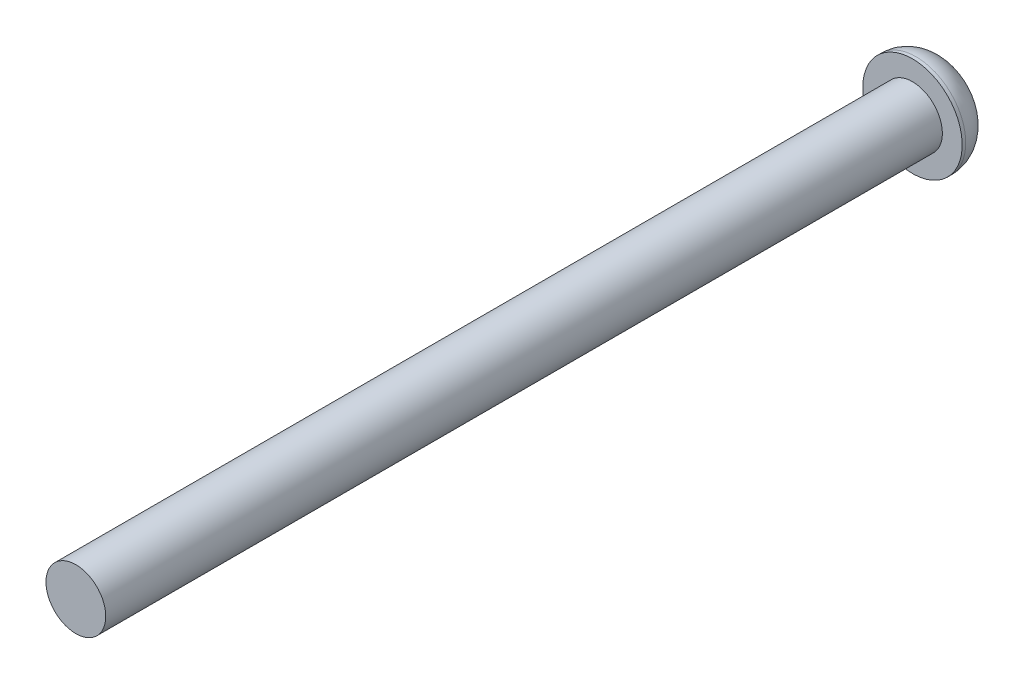
ISO-10303-21;
HEADER;
FILE_DESCRIPTION(('STEP AP214'),'2;1');
FILE_NAME('part.step','',(''),(''),'','','');
FILE_SCHEMA(('AUTOMOTIVE_DESIGN { 1 0 10303 214 1 1 1 1 }'));
ENDSEC;
DATA;
#1=APPLICATION_CONTEXT('core data for automotive mechanical design processes');
#2=APPLICATION_PROTOCOL_DEFINITION('international standard','automotive_design',2000,#1);
#3=PRODUCT_CONTEXT('',#1,'mechanical');
#4=PRODUCT('Part','Part','',(#3));
#5=PRODUCT_RELATED_PRODUCT_CATEGORY('part','',(#4));
#6=PRODUCT_DEFINITION_FORMATION('','',#4);
#7=PRODUCT_DEFINITION_CONTEXT('part definition',#1,'design');
#8=PRODUCT_DEFINITION('design','',#6,#7);
#9=PRODUCT_DEFINITION_SHAPE('','',#8);
#10=(LENGTH_UNIT() NAMED_UNIT(*) SI_UNIT(.MILLI.,.METRE.));
#11=(NAMED_UNIT(*) PLANE_ANGLE_UNIT() SI_UNIT($,.RADIAN.));
#12=(NAMED_UNIT(*) SI_UNIT($,.STERADIAN.) SOLID_ANGLE_UNIT());
#13=UNCERTAINTY_MEASURE_WITH_UNIT(LENGTH_MEASURE(1.E-05),#10,'distance_accuracy_value','');
#14=(GEOMETRIC_REPRESENTATION_CONTEXT(3) GLOBAL_UNCERTAINTY_ASSIGNED_CONTEXT((#13)) GLOBAL_UNIT_ASSIGNED_CONTEXT((#10,
#11,#12)) REPRESENTATION_CONTEXT('',''));
#15=CARTESIAN_POINT('',(0.,0.,0.));
#16=DIRECTION('',(0.,0.,1.));
#17=DIRECTION('',(1.,0.,0.));
#18=AXIS2_PLACEMENT_3D('',#15,#16,#17);
#19=CARTESIAN_POINT('',(0.,0.,70.));
#20=DIRECTION('',(0.,0.,-1.));
#21=DIRECTION('',(-1.,0.,0.));
#22=AXIS2_PLACEMENT_3D('',#19,#20,#21);
#23=CYLINDRICAL_SURFACE('',#22,2.5);
#24=CARTESIAN_POINT('',(0.,0.,70.));
#25=DIRECTION('',(0.,0.,1.));
#26=DIRECTION('',(1.,0.,0.));
#27=AXIS2_PLACEMENT_3D('',#24,#25,#26);
#28=CIRCLE('',#27,2.5);
#29=CARTESIAN_POINT('',(2.5,0.,70.));
#30=VERTEX_POINT('',#29);
#31=EDGE_CURVE('E145',#30,#30,#28,.T.);
#32=ORIENTED_EDGE('',*,*,#31,.F.);
#33=EDGE_LOOP('',(#32));
#34=FACE_BOUND('',#33,.T.);
#35=CARTESIAN_POINT('',(0.,0.,0.));
#36=DIRECTION('',(0.,0.,-1.));
#37=DIRECTION('',(-1.,0.,0.));
#38=AXIS2_PLACEMENT_3D('',#35,#36,#37);
#39=CIRCLE('',#38,2.5);
#40=CARTESIAN_POINT('',(-2.5,0.,0.));
#41=VERTEX_POINT('',#40);
#42=EDGE_CURVE('E142',#41,#41,#39,.T.);
#43=ORIENTED_EDGE('',*,*,#42,.F.);
#44=EDGE_LOOP('',(#43));
#45=FACE_BOUND('',#44,.T.);
#46=ADVANCED_FACE('F32',(#34,#45),#23,.T.);
#47=CARTESIAN_POINT('',(0.,0.,70.));
#48=DIRECTION('',(0.,0.,1.));
#49=DIRECTION('',(1.,0.,0.));
#50=AXIS2_PLACEMENT_3D('',#47,#48,#49);
#51=PLANE('',#50);
#52=ORIENTED_EDGE('',*,*,#31,.T.);
#53=EDGE_LOOP('',(#52));
#54=FACE_BOUND('',#53,.T.);
#55=ADVANCED_FACE('F166',(#54),#51,.T.);
#56=CARTESIAN_POINT('',(0.,0.,0.));
#57=DIRECTION('',(0.,0.,-1.));
#58=DIRECTION('',(-1.,0.,0.));
#59=AXIS2_PLACEMENT_3D('',#56,#57,#58);
#60=PLANE('',#59);
#61=CARTESIAN_POINT('',(0.,0.,0.));
#62=DIRECTION('',(0.,0.,-1.));
#63=DIRECTION('',(-1.,0.,0.));
#64=AXIS2_PLACEMENT_3D('',#61,#62,#63);
#65=CIRCLE('',#64,4.15958487677486);
#66=CARTESIAN_POINT('',(-4.15958487677486,0.,0.));
#67=VERTEX_POINT('',#66);
#68=EDGE_CURVE('E134',#67,#67,#65,.T.);
#69=ORIENTED_EDGE('',*,*,#68,.F.);
#70=EDGE_LOOP('',(#69));
#71=FACE_BOUND('',#70,.T.);
#72=ORIENTED_EDGE('',*,*,#42,.T.);
#73=EDGE_LOOP('',(#72));
#74=FACE_BOUND('',#73,.T.);
#75=ADVANCED_FACE('F171',(#71,#74),#60,.F.);
#76=CARTESIAN_POINT('',(0.,0.,-2.8));
#77=DIRECTION('',(0.,0.,1.));
#78=DIRECTION('',(1.,0.,0.));
#79=AXIS2_PLACEMENT_3D('',#76,#77,#78);
#80=CYLINDRICAL_SURFACE('',#79,4.15958487677486);
#81=CARTESIAN_POINT('',(0.,0.,-0.3));
#82=DIRECTION('',(0.,0.,-1.));
#83=DIRECTION('',(-1.,0.,0.));
#84=AXIS2_PLACEMENT_3D('',#81,#82,#83);
#85=CIRCLE('',#84,4.15958487677486);
#86=CARTESIAN_POINT('',(-4.15958487677486,0.,-0.3));
#87=VERTEX_POINT('',#86);
#88=EDGE_CURVE('E11',#87,#87,#85,.F.);
#89=ORIENTED_EDGE('',*,*,#88,.T.);
#90=EDGE_LOOP('',(#89));
#91=FACE_BOUND('',#90,.T.);
#92=ORIENTED_EDGE('',*,*,#68,.T.);
#93=EDGE_LOOP('',(#92));
#94=FACE_BOUND('',#93,.T.);
#95=ADVANCED_FACE('F161',(#91,#94),#80,.T.);
#96=CARTESIAN_POINT('',(0.,0.,-2.8));
#97=DIRECTION('',(0.,0.,-1.));
#98=DIRECTION('',(-1.,0.,0.));
#99=AXIS2_PLACEMENT_3D('',#96,#97,#98);
#100=PLANE('',#99);
#101=DIRECTION('',(-0.814788791019046,0.579757902947188,0.));
#102=VECTOR('',#101,1.);
#103=CARTESIAN_POINT('',(-0.144973678126217,-1.52414450415627,-2.8));
#104=LINE('',#103,#102);
#105=CARTESIAN_POINT('',(-0.144973678126217,-1.52414450415627,-2.8));
#106=VERTEX_POINT('',#105);
#107=CARTESIAN_POINT('',(-1.39243469870088,-0.636521363940765,-2.8));
#108=VERTEX_POINT('',#107);
#109=EDGE_CURVE('E47',#106,#108,#104,.T.);
#110=ORIENTED_EDGE('',*,*,#109,.F.);
#111=DIRECTION('',(-0.909479467506581,-0.415748840267711,0.));
#112=VECTOR('',#111,1.);
#113=CARTESIAN_POINT('',(1.24746102057466,-0.887623140215509,-2.8));
#114=LINE('',#113,#112);
#115=CARTESIAN_POINT('',(1.24746102057466,-0.887623140215509,-2.8));
#116=VERTEX_POINT('',#115);
#117=EDGE_CURVE('E130',#116,#106,#114,.T.);
#118=ORIENTED_EDGE('',*,*,#117,.F.);
#119=DIRECTION('',(-0.0946906764875342,-0.995506743214898,0.));
#120=VECTOR('',#119,1.);
#121=CARTESIAN_POINT('',(1.39243469870088,0.636521363940765,-2.8));
#122=LINE('',#121,#120);
#123=CARTESIAN_POINT('',(1.39243469870088,0.636521363940765,-2.8));
#124=VERTEX_POINT('',#123);
#125=EDGE_CURVE('E128',#124,#116,#122,.T.);
#126=ORIENTED_EDGE('',*,*,#125,.F.);
#127=DIRECTION('',(0.814788791019046,-0.579757902947188,0.));
#128=VECTOR('',#127,1.);
#129=CARTESIAN_POINT('',(0.144973678126217,1.52414450415627,-2.8));
#130=LINE('',#129,#128);
#131=CARTESIAN_POINT('',(0.144973678126217,1.52414450415627,-2.8));
#132=VERTEX_POINT('',#131);
#133=EDGE_CURVE('E95',#132,#124,#130,.T.);
#134=ORIENTED_EDGE('',*,*,#133,.F.);
#135=DIRECTION('',(0.909479467506581,0.41574884026771,0.));
#136=VECTOR('',#135,1.);
#137=CARTESIAN_POINT('',(-1.24746102057466,0.88762314021551,-2.8));
#138=LINE('',#137,#136);
#139=CARTESIAN_POINT('',(-1.24746102057466,0.88762314021551,-2.8));
#140=VERTEX_POINT('',#139);
#141=EDGE_CURVE('E124',#140,#132,#138,.T.);
#142=ORIENTED_EDGE('',*,*,#141,.F.);
#143=DIRECTION('',(0.0946906764875343,0.995506743214898,0.));
#144=VECTOR('',#143,1.);
#145=CARTESIAN_POINT('',(-1.39243469870088,-0.636521363940765,-2.8));
#146=LINE('',#145,#144);
#147=EDGE_CURVE('E121',#108,#140,#146,.T.);
#148=ORIENTED_EDGE('',*,*,#147,.F.);
#149=EDGE_LOOP('',(#110,#118,#126,#134,#142,#148));
#150=FACE_BOUND('',#149,.T.);
#151=CARTESIAN_POINT('',(0.,0.,-2.8));
#152=DIRECTION('',(0.,0.,-1.));
#153=DIRECTION('',(-1.,0.,0.));
#154=AXIS2_PLACEMENT_3D('',#151,#152,#153);
#155=CIRCLE('',#154,1.65958487677486);
#156=CARTESIAN_POINT('',(-1.65958487677486,0.,-2.8));
#157=VERTEX_POINT('',#156);
#158=EDGE_CURVE('E40',#157,#157,#155,.T.);
#159=ORIENTED_EDGE('',*,*,#158,.T.);
#160=EDGE_LOOP('',(#159));
#161=FACE_BOUND('',#160,.T.);
#162=ADVANCED_FACE('F150',(#150,#161),#100,.T.);
#163=CARTESIAN_POINT('',(0.,0.,-0.3));
#164=DIRECTION('',(0.,0.,-1.));
#165=DIRECTION('',(-1.,0.,0.));
#166=AXIS2_PLACEMENT_3D('',#163,#164,#165);
#167=DEGENERATE_TOROIDAL_SURFACE('',#166,1.65958487677486,2.5,.T.);
#168=ORIENTED_EDGE('',*,*,#88,.F.);
#169=EDGE_LOOP('',(#168));
#170=FACE_BOUND('',#169,.T.);
#171=ORIENTED_EDGE('',*,*,#158,.F.);
#172=EDGE_LOOP('',(#171));
#173=FACE_BOUND('',#172,.T.);
#174=ADVANCED_FACE('F34',(#170,#173),#167,.T.);
#175=CARTESIAN_POINT('',(-0.144973678126217,-1.52414450415627,-0.8));
#176=DIRECTION('',(-0.579757902947188,-0.814788791019046,0.));
#177=DIRECTION('',(0.814788791019046,-0.579757902947188,0.));
#178=AXIS2_PLACEMENT_3D('',#175,#176,#177);
#179=PLANE('',#178);
#180=ORIENTED_EDGE('',*,*,#109,.T.);
#181=DIRECTION('',(0.,0.,-1.));
#182=VECTOR('',#181,1.);
#183=CARTESIAN_POINT('',(-1.39243469870088,-0.636521363940765,-0.8));
#184=LINE('',#183,#182);
#185=CARTESIAN_POINT('',(-1.39243469870088,-0.636521363940765,-0.8));
#186=VERTEX_POINT('',#185);
#187=EDGE_CURVE('E77',#186,#108,#184,.T.);
#188=ORIENTED_EDGE('',*,*,#187,.F.);
#189=DIRECTION('',(-0.814788791019046,0.579757902947188,0.));
#190=VECTOR('',#189,1.);
#191=CARTESIAN_POINT('',(-0.144973678126217,-1.52414450415627,-0.8));
#192=LINE('',#191,#190);
#193=CARTESIAN_POINT('',(-0.144973678126217,-1.52414450415627,-0.8));
#194=VERTEX_POINT('',#193);
#195=EDGE_CURVE('E132',#194,#186,#192,.T.);
#196=ORIENTED_EDGE('',*,*,#195,.F.);
#197=DIRECTION('',(0.,0.,-1.));
#198=VECTOR('',#197,1.);
#199=CARTESIAN_POINT('',(-0.144973678126217,-1.52414450415627,-0.8));
#200=LINE('',#199,#198);
#201=EDGE_CURVE('E55',#194,#106,#200,.T.);
#202=ORIENTED_EDGE('',*,*,#201,.T.);
#203=EDGE_LOOP('',(#180,#188,#196,#202));
#204=FACE_BOUND('',#203,.T.);
#205=ADVANCED_FACE('F153',(#204),#179,.F.);
#206=CARTESIAN_POINT('',(1.24746102057466,-0.887623140215509,-0.8));
#207=DIRECTION('',(0.415748840267711,-0.909479467506581,0.));
#208=DIRECTION('',(0.909479467506581,0.415748840267711,0.));
#209=AXIS2_PLACEMENT_3D('',#206,#207,#208);
#210=PLANE('',#209);
#211=ORIENTED_EDGE('',*,*,#117,.T.);
#212=ORIENTED_EDGE('',*,*,#201,.F.);
#213=DIRECTION('',(-0.909479467506581,-0.415748840267711,0.));
#214=VECTOR('',#213,1.);
#215=CARTESIAN_POINT('',(1.24746102057466,-0.887623140215509,-0.8));
#216=LINE('',#215,#214);
#217=CARTESIAN_POINT('',(1.24746102057466,-0.887623140215509,-0.8));
#218=VERTEX_POINT('',#217);
#219=EDGE_CURVE('E107',#218,#194,#216,.T.);
#220=ORIENTED_EDGE('',*,*,#219,.F.);
#221=DIRECTION('',(0.,0.,-1.));
#222=VECTOR('',#221,1.);
#223=CARTESIAN_POINT('',(1.24746102057466,-0.887623140215509,-0.8));
#224=LINE('',#223,#222);
#225=EDGE_CURVE('E99',#218,#116,#224,.T.);
#226=ORIENTED_EDGE('',*,*,#225,.T.);
#227=EDGE_LOOP('',(#211,#212,#220,#226));
#228=FACE_BOUND('',#227,.T.);
#229=ADVANCED_FACE('F159',(#228),#210,.F.);
#230=CARTESIAN_POINT('',(1.39243469870088,0.636521363940765,-0.8));
#231=DIRECTION('',(0.995506743214898,-0.0946906764875343,0.));
#232=DIRECTION('',(0.0946906764875343,0.995506743214898,0.));
#233=AXIS2_PLACEMENT_3D('',#230,#231,#232);
#234=PLANE('',#233);
#235=ORIENTED_EDGE('',*,*,#125,.T.);
#236=ORIENTED_EDGE('',*,*,#225,.F.);
#237=DIRECTION('',(-0.0946906764875342,-0.995506743214898,0.));
#238=VECTOR('',#237,1.);
#239=CARTESIAN_POINT('',(1.39243469870088,0.636521363940765,-0.8));
#240=LINE('',#239,#238);
#241=CARTESIAN_POINT('',(1.39243469870088,0.636521363940765,-0.8));
#242=VERTEX_POINT('',#241);
#243=EDGE_CURVE('E103',#242,#218,#240,.T.);
#244=ORIENTED_EDGE('',*,*,#243,.F.);
#245=DIRECTION('',(0.,0.,-1.));
#246=VECTOR('',#245,1.);
#247=CARTESIAN_POINT('',(1.39243469870088,0.636521363940765,-0.8));
#248=LINE('',#247,#246);
#249=EDGE_CURVE('E88',#242,#124,#248,.T.);
#250=ORIENTED_EDGE('',*,*,#249,.T.);
#251=EDGE_LOOP('',(#235,#236,#244,#250));
#252=FACE_BOUND('',#251,.T.);
#253=ADVANCED_FACE('F104',(#252),#234,.F.);
#254=CARTESIAN_POINT('',(0.144973678126217,1.52414450415627,-0.8));
#255=DIRECTION('',(0.579757902947188,0.814788791019046,0.));
#256=DIRECTION('',(-0.814788791019047,0.579757902947188,0.));
#257=AXIS2_PLACEMENT_3D('',#254,#255,#256);
#258=PLANE('',#257);
#259=ORIENTED_EDGE('',*,*,#133,.T.);
#260=ORIENTED_EDGE('',*,*,#249,.F.);
#261=DIRECTION('',(0.814788791019046,-0.579757902947188,0.));
#262=VECTOR('',#261,1.);
#263=CARTESIAN_POINT('',(0.144973678126217,1.52414450415627,-0.8));
#264=LINE('',#263,#262);
#265=CARTESIAN_POINT('',(0.144973678126217,1.52414450415627,-0.8));
#266=VERTEX_POINT('',#265);
#267=EDGE_CURVE('E92',#266,#242,#264,.T.);
#268=ORIENTED_EDGE('',*,*,#267,.F.);
#269=DIRECTION('',(0.,0.,-1.));
#270=VECTOR('',#269,1.);
#271=CARTESIAN_POINT('',(0.144973678126217,1.52414450415627,-0.8));
#272=LINE('',#271,#270);
#273=EDGE_CURVE('E100',#266,#132,#272,.T.);
#274=ORIENTED_EDGE('',*,*,#273,.T.);
#275=EDGE_LOOP('',(#259,#260,#268,#274));
#276=FACE_BOUND('',#275,.T.);
#277=ADVANCED_FACE('F90',(#276),#258,.F.);
#278=CARTESIAN_POINT('',(-1.24746102057466,0.88762314021551,-0.8));
#279=DIRECTION('',(-0.41574884026771,0.909479467506581,0.));
#280=DIRECTION('',(-0.909479467506581,-0.41574884026771,0.));
#281=AXIS2_PLACEMENT_3D('',#278,#279,#280);
#282=PLANE('',#281);
#283=ORIENTED_EDGE('',*,*,#141,.T.);
#284=ORIENTED_EDGE('',*,*,#273,.F.);
#285=DIRECTION('',(0.909479467506581,0.41574884026771,0.));
#286=VECTOR('',#285,1.);
#287=CARTESIAN_POINT('',(-1.24746102057466,0.88762314021551,-0.8));
#288=LINE('',#287,#286);
#289=CARTESIAN_POINT('',(-1.24746102057466,0.88762314021551,-0.8));
#290=VERTEX_POINT('',#289);
#291=EDGE_CURVE('E113',#290,#266,#288,.T.);
#292=ORIENTED_EDGE('',*,*,#291,.F.);
#293=DIRECTION('',(0.,0.,-1.));
#294=VECTOR('',#293,1.);
#295=CARTESIAN_POINT('',(-1.24746102057466,0.88762314021551,-0.8));
#296=LINE('',#295,#294);
#297=EDGE_CURVE('E137',#290,#140,#296,.T.);
#298=ORIENTED_EDGE('',*,*,#297,.T.);
#299=EDGE_LOOP('',(#283,#284,#292,#298));
#300=FACE_BOUND('',#299,.T.);
#301=ADVANCED_FACE('F186',(#300),#282,.F.);
#302=CARTESIAN_POINT('',(-1.39243469870088,-0.636521363940765,-0.8));
#303=DIRECTION('',(-0.995506743214898,0.0946906764875343,0.));
#304=DIRECTION('',(-0.0946906764875343,-0.995506743214898,0.));
#305=AXIS2_PLACEMENT_3D('',#302,#303,#304);
#306=PLANE('',#305);
#307=ORIENTED_EDGE('',*,*,#147,.T.);
#308=ORIENTED_EDGE('',*,*,#297,.F.);
#309=DIRECTION('',(0.0946906764875343,0.995506743214898,0.));
#310=VECTOR('',#309,1.);
#311=CARTESIAN_POINT('',(-1.39243469870088,-0.636521363940765,-0.8));
#312=LINE('',#311,#310);
#313=EDGE_CURVE('E115',#186,#290,#312,.T.);
#314=ORIENTED_EDGE('',*,*,#313,.F.);
#315=ORIENTED_EDGE('',*,*,#187,.T.);
#316=EDGE_LOOP('',(#307,#308,#314,#315));
#317=FACE_BOUND('',#316,.T.);
#318=ADVANCED_FACE('F183',(#317),#306,.F.);
#319=CARTESIAN_POINT('',(0.,0.,-0.8));
#320=DIRECTION('',(0.,0.,-1.));
#321=DIRECTION('',(-1.,0.,0.));
#322=AXIS2_PLACEMENT_3D('',#319,#320,#321);
#323=PLANE('',#322);
#324=ORIENTED_EDGE('',*,*,#195,.T.);
#325=ORIENTED_EDGE('',*,*,#313,.T.);
#326=ORIENTED_EDGE('',*,*,#291,.T.);
#327=ORIENTED_EDGE('',*,*,#267,.T.);
#328=ORIENTED_EDGE('',*,*,#243,.T.);
#329=ORIENTED_EDGE('',*,*,#219,.T.);
#330=EDGE_LOOP('',(#324,#325,#326,#327,#328,#329));
#331=FACE_BOUND('',#330,.T.);
#332=ADVANCED_FACE('F110',(#331),#323,.T.);
#333=CLOSED_SHELL('',(#46,#55,#75,#95,#162,#174,#205,#229,#253,#277,#301,#318,#332));
#334=MANIFOLD_SOLID_BREP('B2',#333);
#335=ADVANCED_BREP_SHAPE_REPRESENTATION('',(#18,#334),#14);
#336=SHAPE_DEFINITION_REPRESENTATION(#9,#335);
ENDSEC;
END-ISO-10303-21;
